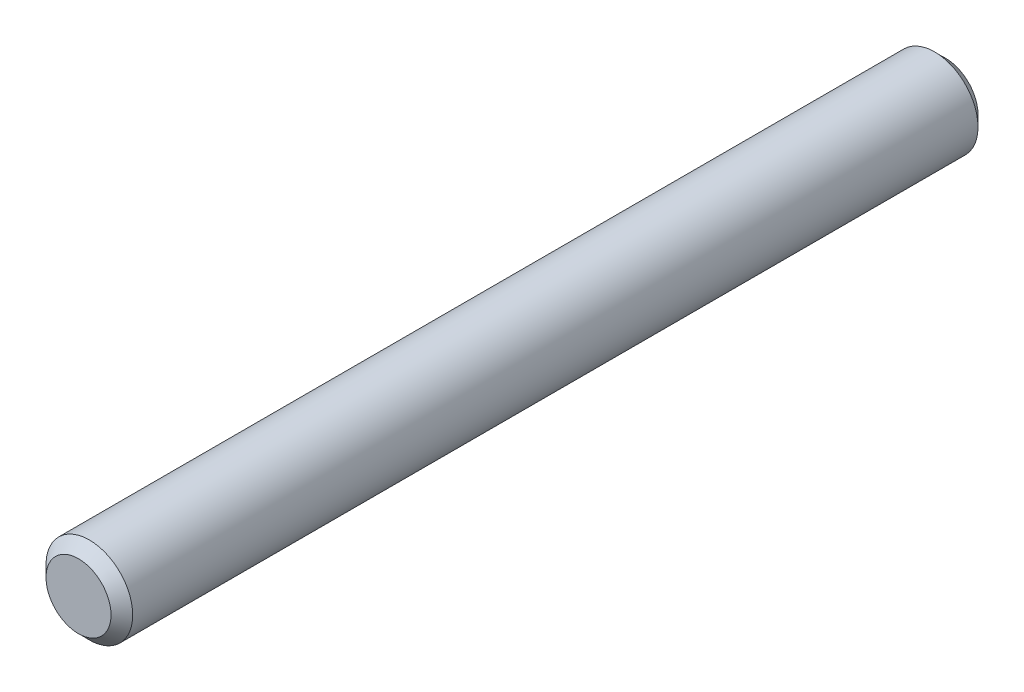
ISO-10303-21;
HEADER;
FILE_DESCRIPTION(('STEP AP214'),'2;1');
FILE_NAME('part.step','',(''),(''),'','','');
FILE_SCHEMA(('AUTOMOTIVE_DESIGN { 1 0 10303 214 1 1 1 1 }'));
ENDSEC;
DATA;
#1=APPLICATION_CONTEXT('core data for automotive mechanical design processes');
#2=APPLICATION_PROTOCOL_DEFINITION('international standard','automotive_design',2000,#1);
#3=PRODUCT_CONTEXT('',#1,'mechanical');
#4=PRODUCT('Part','Part','',(#3));
#5=PRODUCT_RELATED_PRODUCT_CATEGORY('part','',(#4));
#6=PRODUCT_DEFINITION_FORMATION('','',#4);
#7=PRODUCT_DEFINITION_CONTEXT('part definition',#1,'design');
#8=PRODUCT_DEFINITION('design','',#6,#7);
#9=PRODUCT_DEFINITION_SHAPE('','',#8);
#10=(LENGTH_UNIT() NAMED_UNIT(*) SI_UNIT(.MILLI.,.METRE.));
#11=(NAMED_UNIT(*) PLANE_ANGLE_UNIT() SI_UNIT($,.RADIAN.));
#12=(NAMED_UNIT(*) SI_UNIT($,.STERADIAN.) SOLID_ANGLE_UNIT());
#13=UNCERTAINTY_MEASURE_WITH_UNIT(LENGTH_MEASURE(1.E-05),#10,'distance_accuracy_value','');
#14=(GEOMETRIC_REPRESENTATION_CONTEXT(3) GLOBAL_UNCERTAINTY_ASSIGNED_CONTEXT((#13)) GLOBAL_UNIT_ASSIGNED_CONTEXT((#10,
#11,#12)) REPRESENTATION_CONTEXT('',''));
#15=CARTESIAN_POINT('',(0.,0.,0.));
#16=DIRECTION('',(0.,0.,1.));
#17=DIRECTION('',(1.,0.,0.));
#18=AXIS2_PLACEMENT_3D('',#15,#16,#17);
#19=CARTESIAN_POINT('',(0.,0.,40.));
#20=DIRECTION('',(0.,0.,-1.));
#21=DIRECTION('',(-1.,0.,0.));
#22=AXIS2_PLACEMENT_3D('',#19,#20,#21);
#23=CYLINDRICAL_SURFACE('',#22,4.);
#24=CARTESIAN_POINT('',(0.,0.,-39.));
#25=DIRECTION('',(0.,0.,1.));
#26=DIRECTION('',(1.,0.,0.));
#27=AXIS2_PLACEMENT_3D('',#24,#25,#26);
#28=CIRCLE('',#27,4.);
#29=CARTESIAN_POINT('',(4.,0.,-39.));
#30=VERTEX_POINT('',#29);
#31=EDGE_CURVE('E48',#30,#30,#28,.T.);
#32=ORIENTED_EDGE('',*,*,#31,.T.);
#33=EDGE_LOOP('',(#32));
#34=FACE_BOUND('',#33,.T.);
#35=CARTESIAN_POINT('',(0.,0.,39.));
#36=DIRECTION('',(0.,0.,1.));
#37=DIRECTION('',(1.,0.,0.));
#38=AXIS2_PLACEMENT_3D('',#35,#36,#37);
#39=CIRCLE('',#38,4.);
#40=CARTESIAN_POINT('',(4.,0.,39.));
#41=VERTEX_POINT('',#40);
#42=EDGE_CURVE('E53',#41,#41,#39,.F.);
#43=ORIENTED_EDGE('',*,*,#42,.T.);
#44=EDGE_LOOP('',(#43));
#45=FACE_BOUND('',#44,.T.);
#46=ADVANCED_FACE('F34',(#34,#45),#23,.T.);
#47=CARTESIAN_POINT('',(0.,0.,40.));
#48=DIRECTION('',(0.,0.,1.));
#49=DIRECTION('',(1.,0.,0.));
#50=AXIS2_PLACEMENT_3D('',#47,#48,#49);
#51=PLANE('',#50);
#52=CARTESIAN_POINT('',(0.,0.,40.));
#53=DIRECTION('',(0.,0.,1.));
#54=DIRECTION('',(1.,0.,0.));
#55=AXIS2_PLACEMENT_3D('',#52,#53,#54);
#56=CIRCLE('',#55,3.00000000000001);
#57=CARTESIAN_POINT('',(3.00000000000001,0.,40.));
#58=VERTEX_POINT('',#57);
#59=EDGE_CURVE('E10',#58,#58,#56,.T.);
#60=ORIENTED_EDGE('',*,*,#59,.T.);
#61=EDGE_LOOP('',(#60));
#62=FACE_BOUND('',#61,.T.);
#63=ADVANCED_FACE('F69',(#62),#51,.T.);
#64=CARTESIAN_POINT('',(0.,0.,-40.));
#65=DIRECTION('',(0.,0.,1.));
#66=DIRECTION('',(1.,0.,0.));
#67=AXIS2_PLACEMENT_3D('',#64,#65,#66);
#68=PLANE('',#67);
#69=CARTESIAN_POINT('',(0.,0.,-40.));
#70=DIRECTION('',(0.,0.,1.));
#71=DIRECTION('',(1.,0.,0.));
#72=AXIS2_PLACEMENT_3D('',#69,#70,#71);
#73=CIRCLE('',#72,2.99999999999997);
#74=CARTESIAN_POINT('',(2.99999999999997,0.,-40.));
#75=VERTEX_POINT('',#74);
#76=EDGE_CURVE('E42',#75,#75,#73,.F.);
#77=ORIENTED_EDGE('',*,*,#76,.T.);
#78=EDGE_LOOP('',(#77));
#79=FACE_BOUND('',#78,.T.);
#80=ADVANCED_FACE('F66',(#79),#68,.F.);
#81=CARTESIAN_POINT('',(0.,0.,-39.));
#82=DIRECTION('',(0.,0.,1.));
#83=DIRECTION('',(1.,0.,0.));
#84=AXIS2_PLACEMENT_3D('',#81,#82,#83);
#85=CONICAL_SURFACE('',#84,4.,0.78539816339745);
#86=ORIENTED_EDGE('',*,*,#76,.F.);
#87=EDGE_LOOP('',(#86));
#88=FACE_BOUND('',#87,.T.);
#89=ORIENTED_EDGE('',*,*,#31,.F.);
#90=EDGE_LOOP('',(#89));
#91=FACE_BOUND('',#90,.T.);
#92=ADVANCED_FACE('F62',(#88,#91),#85,.T.);
#93=CARTESIAN_POINT('',(0.,0.,40.));
#94=DIRECTION('',(0.,0.,-1.));
#95=DIRECTION('',(-1.,0.,0.));
#96=AXIS2_PLACEMENT_3D('',#93,#94,#95);
#97=CONICAL_SURFACE('',#96,3.00000000000001,0.785398163397447);
#98=ORIENTED_EDGE('',*,*,#42,.F.);
#99=EDGE_LOOP('',(#98));
#100=FACE_BOUND('',#99,.T.);
#101=ORIENTED_EDGE('',*,*,#59,.F.);
#102=EDGE_LOOP('',(#101));
#103=FACE_BOUND('',#102,.T.);
#104=ADVANCED_FACE('F36',(#100,#103),#97,.T.);
#105=CLOSED_SHELL('',(#46,#63,#80,#92,#104));
#106=MANIFOLD_SOLID_BREP('B2',#105);
#107=ADVANCED_BREP_SHAPE_REPRESENTATION('',(#18,#106),#14);
#108=SHAPE_DEFINITION_REPRESENTATION(#9,#107);
ENDSEC;
END-ISO-10303-21;
